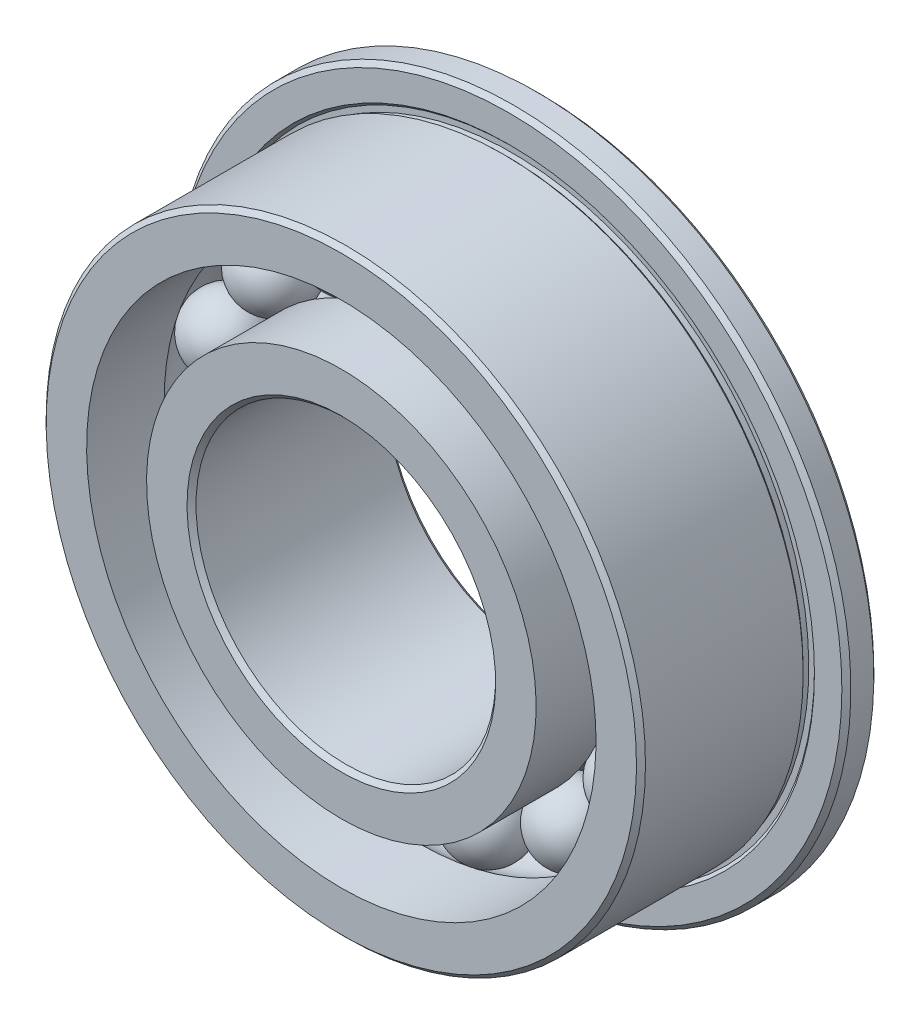
ISO-10303-21;
HEADER;
FILE_DESCRIPTION(('STEP AP214'),'2;1');
FILE_NAME('part.step','',(''),(''),'','','');
FILE_SCHEMA(('AUTOMOTIVE_DESIGN { 1 0 10303 214 1 1 1 1 }'));
ENDSEC;
DATA;
#1=APPLICATION_CONTEXT('core data for automotive mechanical design processes');
#2=APPLICATION_PROTOCOL_DEFINITION('international standard','automotive_design',2000,#1);
#3=PRODUCT_CONTEXT('',#1,'mechanical');
#4=PRODUCT('Part','Part','',(#3));
#5=PRODUCT_RELATED_PRODUCT_CATEGORY('part','',(#4));
#6=PRODUCT_DEFINITION_FORMATION('','',#4);
#7=PRODUCT_DEFINITION_CONTEXT('part definition',#1,'design');
#8=PRODUCT_DEFINITION('design','',#6,#7);
#9=PRODUCT_DEFINITION_SHAPE('','',#8);
#10=(LENGTH_UNIT() NAMED_UNIT(*) SI_UNIT(.MILLI.,.METRE.));
#11=(NAMED_UNIT(*) PLANE_ANGLE_UNIT() SI_UNIT($,.RADIAN.));
#12=(NAMED_UNIT(*) SI_UNIT($,.STERADIAN.) SOLID_ANGLE_UNIT());
#13=UNCERTAINTY_MEASURE_WITH_UNIT(LENGTH_MEASURE(1.E-05),#10,'distance_accuracy_value','');
#14=(GEOMETRIC_REPRESENTATION_CONTEXT(3) GLOBAL_UNCERTAINTY_ASSIGNED_CONTEXT((#13)) GLOBAL_UNIT_ASSIGNED_CONTEXT((#10,
#11,#12)) REPRESENTATION_CONTEXT('',''));
#15=CARTESIAN_POINT('',(0.,0.,0.));
#16=DIRECTION('',(0.,0.,1.));
#17=DIRECTION('',(1.,0.,0.));
#18=AXIS2_PLACEMENT_3D('',#15,#16,#17);
#19=CARTESIAN_POINT('',(-1.45281244698633,3.26307018151718,0.));
#20=DIRECTION('',(-0.406736643075789,0.913545457642606,0.));
#21=DIRECTION('',(0.913545457642606,0.406736643075789,0.));
#22=AXIS2_PLACEMENT_3D('',#19,#20,#21);
#23=SPHERICAL_SURFACE('',#22,0.5953125);
#24=CARTESIAN_POINT('',(-1.69494785481739,3.80691521177005,0.));
#25=VERTEX_POINT('',#24);
#26=VERTEX_LOOP('',#25);
#27=FACE_BOUND('',#26,.T.);
#28=ADVANCED_FACE('F45',(#27),#23,.T.);
#29=CLOSED_SHELL('',(#28));
#30=MANIFOLD_SOLID_BREP('B2',#29);
#31=CARTESIAN_POINT('',(-2.65442042350204,2.39005088458808,0.));
#32=DIRECTION('',(-0.743144825477386,0.669130606358867,0.));
#33=DIRECTION('',(0.669130606358867,0.743144825477386,0.));
#34=AXIS2_PLACEMENT_3D('',#31,#32,#33);
#35=SPHERICAL_SURFACE('',#34,0.5953125);
#36=CARTESIAN_POINT('',(-3.09682382741905,2.78839269868609,0.));
#37=VERTEX_POINT('',#36);
#38=VERTEX_LOOP('',#37);
#39=FACE_BOUND('',#38,.T.);
#40=ADVANCED_FACE('F64',(#39),#35,.T.);
#41=CLOSED_SHELL('',(#40));
#42=MANIFOLD_SOLID_BREP('B7',#41);
#43=CARTESIAN_POINT('',(-3.39705499414174,1.10377007678305,0.));
#44=DIRECTION('',(-0.95105651629515,0.309016994374957,0.));
#45=DIRECTION('',(0.309016994374957,0.95105651629515,0.));
#46=AXIS2_PLACEMENT_3D('',#43,#44,#45);
#47=SPHERICAL_SURFACE('',#46,0.5953125);
#48=CARTESIAN_POINT('',(-3.9632308264987,1.28773175624689,0.));
#49=VERTEX_POINT('',#48);
#50=VERTEX_LOOP('',#49);
#51=FACE_BOUND('',#50,.T.);
#52=ADVANCED_FACE('F82',(#51),#47,.T.);
#53=CLOSED_SHELL('',(#52));
#54=MANIFOLD_SOLID_BREP('B41',#53);
#55=CARTESIAN_POINT('',(-3.55230789501856,-0.373362604734115,0.));
#56=DIRECTION('',(-0.994521895368274,-0.104528463267644,0.));
#57=DIRECTION('',(-0.104528463267644,0.994521895368274,0.));
#58=AXIS2_PLACEMENT_3D('',#55,#56,#57);
#59=SPHERICAL_SURFACE('',#58,0.5953125);
#60=CARTESIAN_POINT('',(-4.14435921085498,-0.435589705523134,0.));
#61=VERTEX_POINT('',#60);
#62=VERTEX_LOOP('',#61);
#63=FACE_BOUND('',#62,.T.);
#64=ADVANCED_FACE('F100',(#63),#59,.T.);
#65=CLOSED_SHELL('',(#64));
#66=MANIFOLD_SOLID_BREP('B60',#65);
#67=CARTESIAN_POINT('',(-3.09333448914256,-1.78593749999997,0.));
#68=DIRECTION('',(-0.866025403784443,-0.499999999999992,0.));
#69=DIRECTION('',(-0.499999999999992,0.866025403784443,0.));
#70=AXIS2_PLACEMENT_3D('',#67,#68,#69);
#71=SPHERICAL_SURFACE('',#70,0.5953125);
#72=CARTESIAN_POINT('',(-3.60889023733298,-2.08359374999997,0.));
#73=VERTEX_POINT('',#72);
#74=VERTEX_LOOP('',#73);
#75=FACE_BOUND('',#74,.T.);
#76=ADVANCED_FACE('F119',(#75),#71,.T.);
#77=CLOSED_SHELL('',(#76));
#78=MANIFOLD_SOLID_BREP('B78',#77);
#79=CARTESIAN_POINT('',(-2.0994954480322,-2.889707576783,0.));
#80=DIRECTION('',(-0.58778525229248,-0.809016994374943,0.));
#81=DIRECTION('',(-0.809016994374943,0.58778525229248,0.));
#82=AXIS2_PLACEMENT_3D('',#79,#80,#81);
#83=SPHERICAL_SURFACE('',#82,0.5953125);
#84=CARTESIAN_POINT('',(-2.44941135603757,-3.37132550624683,0.));
#85=VERTEX_POINT('',#84);
#86=VERTEX_LOOP('',#85);
#87=FACE_BOUND('',#86,.T.);
#88=ADVANCED_FACE('F138',(#87),#83,.T.);
#89=CLOSED_SHELL('',(#88));
#90=MANIFOLD_SOLID_BREP('B96',#89);
#91=CARTESIAN_POINT('',(-0.74263457063971,-3.49382096137106,0.));
#92=DIRECTION('',(-0.207911690817766,-0.978147600733804,0.));
#93=DIRECTION('',(-0.978147600733804,0.207911690817766,0.));
#94=AXIS2_PLACEMENT_3D('',#91,#92,#93);
#95=SPHERICAL_SURFACE('',#94,0.5953125);
#96=CARTESIAN_POINT('',(-0.866406999079661,-4.0761244549329,0.));
#97=VERTEX_POINT('',#96);
#98=VERTEX_LOOP('',#97);
#99=FACE_BOUND('',#98,.T.);
#100=ADVANCED_FACE('F157',(#99),#95,.T.);
#101=CLOSED_SHELL('',(#100));
#102=MANIFOLD_SOLID_BREP('B115',#101);
#103=CARTESIAN_POINT('',(0.742634570639662,-3.49382096137107,0.));
#104=DIRECTION('',(0.207911690817753,-0.978147600733807,0.));
#105=DIRECTION('',(-0.978147600733807,-0.207911690817753,0.));
#106=AXIS2_PLACEMENT_3D('',#103,#104,#105);
#107=SPHERICAL_SURFACE('',#106,0.5953125);
#108=CARTESIAN_POINT('',(0.866406999079606,-4.07612445493291,0.));
#109=VERTEX_POINT('',#108);
#110=VERTEX_LOOP('',#109);
#111=FACE_BOUND('',#110,.T.);
#112=ADVANCED_FACE('F176',(#111),#107,.T.);
#113=CLOSED_SHELL('',(#112));
#114=MANIFOLD_SOLID_BREP('B134',#113);
#115=CARTESIAN_POINT('',(2.09949544803216,-2.88970757678303,0.));
#116=DIRECTION('',(0.587785252292469,-0.80901699437495,0.));
#117=DIRECTION('',(-0.80901699437495,-0.587785252292469,0.));
#118=AXIS2_PLACEMENT_3D('',#115,#116,#117);
#119=SPHERICAL_SURFACE('',#118,0.5953125);
#120=CARTESIAN_POINT('',(2.44941135603752,-3.37132550624686,0.));
#121=VERTEX_POINT('',#120);
#122=VERTEX_LOOP('',#121);
#123=FACE_BOUND('',#122,.T.);
#124=ADVANCED_FACE('F195',(#123),#119,.T.);
#125=CLOSED_SHELL('',(#124));
#126=MANIFOLD_SOLID_BREP('B153',#125);
#127=CARTESIAN_POINT('',(3.09333448914253,-1.78593750000001,0.));
#128=DIRECTION('',(0.866025403784436,-0.500000000000004,0.));
#129=DIRECTION('',(-0.500000000000004,-0.866025403784436,0.));
#130=AXIS2_PLACEMENT_3D('',#127,#128,#129);
#131=SPHERICAL_SURFACE('',#130,0.5953125);
#132=CARTESIAN_POINT('',(3.60889023733296,-2.08359375000002,0.));
#133=VERTEX_POINT('',#132);
#134=VERTEX_LOOP('',#133);
#135=FACE_BOUND('',#134,.T.);
#136=ADVANCED_FACE('F214',(#135),#131,.T.);
#137=CLOSED_SHELL('',(#136));
#138=MANIFOLD_SOLID_BREP('B172',#137);
#139=CARTESIAN_POINT('',(3.55230789501855,-0.373362604734163,0.));
#140=DIRECTION('',(0.994521895368273,-0.104528463267657,0.));
#141=DIRECTION('',(-0.104528463267657,-0.994521895368273,0.));
#142=AXIS2_PLACEMENT_3D('',#139,#140,#141);
#143=SPHERICAL_SURFACE('',#142,0.5953125);
#144=CARTESIAN_POINT('',(4.14435921085497,-0.43558970552319,0.));
#145=VERTEX_POINT('',#144);
#146=VERTEX_LOOP('',#145);
#147=FACE_BOUND('',#146,.T.);
#148=ADVANCED_FACE('F233',(#147),#143,.T.);
#149=CLOSED_SHELL('',(#148));
#150=MANIFOLD_SOLID_BREP('B191',#149);
#151=CARTESIAN_POINT('',(3.39705499414175,1.10377007678301,0.));
#152=DIRECTION('',(0.951056516295154,0.309016994374945,0.));
#153=DIRECTION('',(0.309016994374945,-0.951056516295154,0.));
#154=AXIS2_PLACEMENT_3D('',#151,#152,#153);
#155=SPHERICAL_SURFACE('',#154,0.5953125);
#156=CARTESIAN_POINT('',(3.96323082649871,1.28773175624684,0.));
#157=VERTEX_POINT('',#156);
#158=VERTEX_LOOP('',#157);
#159=FACE_BOUND('',#158,.T.);
#160=ADVANCED_FACE('F252',(#159),#155,.T.);
#161=CLOSED_SHELL('',(#160));
#162=MANIFOLD_SOLID_BREP('B210',#161);
#163=CARTESIAN_POINT('',(2.65442042350207,2.39005088458804,0.));
#164=DIRECTION('',(0.743144825477395,0.669130606358857,0.));
#165=DIRECTION('',(0.669130606358857,-0.743144825477395,0.));
#166=AXIS2_PLACEMENT_3D('',#163,#164,#165);
#167=SPHERICAL_SURFACE('',#166,0.5953125);
#168=CARTESIAN_POINT('',(3.09682382741908,2.78839269868605,0.));
#169=VERTEX_POINT('',#168);
#170=VERTEX_LOOP('',#169);
#171=FACE_BOUND('',#170,.T.);
#172=ADVANCED_FACE('F270',(#171),#167,.T.);
#173=CLOSED_SHELL('',(#172));
#174=MANIFOLD_SOLID_BREP('B229',#173);
#175=CARTESIAN_POINT('',(1.45281244698638,3.26307018151716,0.));
#176=DIRECTION('',(0.406736643075801,0.913545457642601,0.));
#177=DIRECTION('',(0.913545457642601,-0.406736643075801,0.));
#178=AXIS2_PLACEMENT_3D('',#175,#176,#177);
#179=SPHERICAL_SURFACE('',#178,0.5953125);
#180=CARTESIAN_POINT('',(1.69494785481744,3.80691521177002,0.));
#181=VERTEX_POINT('',#180);
#182=VERTEX_LOOP('',#181);
#183=FACE_BOUND('',#182,.T.);
#184=ADVANCED_FACE('F288',(#183),#179,.T.);
#185=CLOSED_SHELL('',(#184));
#186=MANIFOLD_SOLID_BREP('B248',#185);
#187=CARTESIAN_POINT('',(0.,3.571875,0.));
#188=DIRECTION('',(0.,1.,0.));
#189=DIRECTION('',(1.,0.,0.));
#190=AXIS2_PLACEMENT_3D('',#187,#188,#189);
#191=SPHERICAL_SURFACE('',#190,0.5953125);
#192=CARTESIAN_POINT('',(0.,4.1671875,0.));
#193=VERTEX_POINT('',#192);
#194=VERTEX_LOOP('',#193);
#195=FACE_BOUND('',#194,.T.);
#196=ADVANCED_FACE('F310',(#195),#191,.T.);
#197=CLOSED_SHELL('',(#196));
#198=MANIFOLD_SOLID_BREP('B266',#197);
#199=CARTESIAN_POINT('',(0.,0.,0.));
#200=DIRECTION('',(0.,0.,1.));
#201=DIRECTION('',(0.,-1.,0.));
#202=AXIS2_PLACEMENT_3D('',#199,#200,#201);
#203=CYLINDRICAL_SURFACE('',#202,3.095625);
#204=CARTESIAN_POINT('',(0.,0.,-0.3571875));
#205=DIRECTION('',(0.,0.,1.));
#206=DIRECTION('',(0.,-1.,0.));
#207=AXIS2_PLACEMENT_3D('',#204,#205,#206);
#208=CIRCLE('',#207,3.095625);
#209=CARTESIAN_POINT('',(0.,-3.095625,-0.3571875));
#210=VERTEX_POINT('',#209);
#211=EDGE_CURVE('E357',#210,#210,#208,.T.);
#212=ORIENTED_EDGE('',*,*,#211,.F.);
#213=EDGE_LOOP('',(#212));
#214=FACE_BOUND('',#213,.T.);
#215=CARTESIAN_POINT('',(0.,0.,-1.5875));
#216=DIRECTION('',(0.,0.,1.));
#217=DIRECTION('',(0.,-1.,0.));
#218=AXIS2_PLACEMENT_3D('',#215,#216,#217);
#219=CIRCLE('',#218,3.095625);
#220=CARTESIAN_POINT('',(0.,-3.095625,-1.5875));
#221=VERTEX_POINT('',#220);
#222=EDGE_CURVE('E368',#221,#221,#219,.T.);
#223=ORIENTED_EDGE('',*,*,#222,.T.);
#224=EDGE_LOOP('',(#223));
#225=FACE_BOUND('',#224,.T.);
#226=ADVANCED_FACE('F332',(#214,#225),#203,.T.);
#227=CARTESIAN_POINT('',(0.,0.,0.));
#228=DIRECTION('',(0.,0.,1.));
#229=DIRECTION('',(0.,-1.,0.));
#230=AXIS2_PLACEMENT_3D('',#227,#228,#229);
#231=TOROIDAL_SURFACE('',#230,3.571875,0.5953125);
#232=CARTESIAN_POINT('',(0.,0.,0.3571875));
#233=DIRECTION('',(0.,0.,1.));
#234=DIRECTION('',(0.,-1.,0.));
#235=AXIS2_PLACEMENT_3D('',#232,#233,#234);
#236=CIRCLE('',#235,3.095625);
#237=CARTESIAN_POINT('',(0.,-3.095625,0.357187499999999));
#238=VERTEX_POINT('',#237);
#239=EDGE_CURVE('E361',#238,#238,#236,.T.);
#240=ORIENTED_EDGE('',*,*,#239,.F.);
#241=EDGE_LOOP('',(#240));
#242=FACE_BOUND('',#241,.T.);
#243=ORIENTED_EDGE('',*,*,#211,.T.);
#244=EDGE_LOOP('',(#243));
#245=FACE_BOUND('',#244,.T.);
#246=ADVANCED_FACE('F388',(#242,#245),#231,.F.);
#247=CARTESIAN_POINT('',(0.,0.,0.));
#248=DIRECTION('',(0.,0.,1.));
#249=DIRECTION('',(0.,-1.,0.));
#250=AXIS2_PLACEMENT_3D('',#247,#248,#249);
#251=CYLINDRICAL_SURFACE('',#250,3.095625);
#252=CARTESIAN_POINT('',(0.,0.,1.5875));
#253=DIRECTION('',(0.,0.,1.));
#254=DIRECTION('',(0.,-1.,0.));
#255=AXIS2_PLACEMENT_3D('',#252,#253,#254);
#256=CIRCLE('',#255,3.095625);
#257=CARTESIAN_POINT('',(0.,-3.095625,1.5875));
#258=VERTEX_POINT('',#257);
#259=EDGE_CURVE('E365',#258,#258,#256,.T.);
#260=ORIENTED_EDGE('',*,*,#259,.F.);
#261=EDGE_LOOP('',(#260));
#262=FACE_BOUND('',#261,.T.);
#263=ORIENTED_EDGE('',*,*,#239,.T.);
#264=EDGE_LOOP('',(#263));
#265=FACE_BOUND('',#264,.T.);
#266=ADVANCED_FACE('F394',(#262,#265),#251,.T.);
#267=CARTESIAN_POINT('',(0.,2.38125,1.5875));
#268=DIRECTION('',(0.,0.,-1.));
#269=DIRECTION('',(0.,1.,0.));
#270=AXIS2_PLACEMENT_3D('',#267,#268,#269);
#271=PLANE('',#270);
#272=CARTESIAN_POINT('',(0.,0.,1.5875));
#273=DIRECTION('',(0.,0.,-1.));
#274=DIRECTION('',(0.,1.,0.));
#275=AXIS2_PLACEMENT_3D('',#272,#273,#274);
#276=CIRCLE('',#275,2.4526875);
#277=CARTESIAN_POINT('',(0.,2.4526875,1.5875));
#278=VERTEX_POINT('',#277);
#279=EDGE_CURVE('E309',#278,#278,#276,.T.);
#280=ORIENTED_EDGE('',*,*,#279,.T.);
#281=EDGE_LOOP('',(#280));
#282=FACE_BOUND('',#281,.T.);
#283=ORIENTED_EDGE('',*,*,#259,.T.);
#284=EDGE_LOOP('',(#283));
#285=FACE_BOUND('',#284,.T.);
#286=ADVANCED_FACE('F385',(#282,#285),#271,.F.);
#287=CARTESIAN_POINT('',(0.,0.,0.));
#288=DIRECTION('',(0.,0.,1.));
#289=DIRECTION('',(0.,-1.,0.));
#290=AXIS2_PLACEMENT_3D('',#287,#288,#289);
#291=CYLINDRICAL_SURFACE('',#290,2.38125);
#292=CARTESIAN_POINT('',(0.,0.,-1.5160625));
#293=DIRECTION('',(0.,0.,1.));
#294=DIRECTION('',(0.,-1.,0.));
#295=AXIS2_PLACEMENT_3D('',#292,#293,#294);
#296=CIRCLE('',#295,2.38125);
#297=CARTESIAN_POINT('',(0.,-2.38125,-1.5160625));
#298=VERTEX_POINT('',#297);
#299=EDGE_CURVE('E340',#298,#298,#296,.F.);
#300=ORIENTED_EDGE('',*,*,#299,.T.);
#301=EDGE_LOOP('',(#300));
#302=FACE_BOUND('',#301,.T.);
#303=CARTESIAN_POINT('',(0.,0.,1.5160625));
#304=DIRECTION('',(0.,0.,-1.));
#305=DIRECTION('',(0.,1.,0.));
#306=AXIS2_PLACEMENT_3D('',#303,#304,#305);
#307=CIRCLE('',#306,2.38125);
#308=CARTESIAN_POINT('',(0.,2.38125,1.5160625));
#309=VERTEX_POINT('',#308);
#310=EDGE_CURVE('E346',#309,#309,#307,.F.);
#311=ORIENTED_EDGE('',*,*,#310,.T.);
#312=EDGE_LOOP('',(#311));
#313=FACE_BOUND('',#312,.T.);
#314=ADVANCED_FACE('F377',(#302,#313),#291,.F.);
#315=CARTESIAN_POINT('',(0.,3.095625,-1.5875));
#316=DIRECTION('',(0.,0.,1.));
#317=DIRECTION('',(0.,-1.,0.));
#318=AXIS2_PLACEMENT_3D('',#315,#316,#317);
#319=PLANE('',#318);
#320=CARTESIAN_POINT('',(0.,0.,-1.5875));
#321=DIRECTION('',(0.,0.,1.));
#322=DIRECTION('',(0.,-1.,0.));
#323=AXIS2_PLACEMENT_3D('',#320,#321,#322);
#324=CIRCLE('',#323,2.4526875);
#325=CARTESIAN_POINT('',(0.,-2.4526875,-1.5875));
#326=VERTEX_POINT('',#325);
#327=EDGE_CURVE('E352',#326,#326,#324,.T.);
#328=ORIENTED_EDGE('',*,*,#327,.T.);
#329=EDGE_LOOP('',(#328));
#330=FACE_BOUND('',#329,.T.);
#331=ORIENTED_EDGE('',*,*,#222,.F.);
#332=EDGE_LOOP('',(#331));
#333=FACE_BOUND('',#332,.T.);
#334=ADVANCED_FACE('F374',(#330,#333),#319,.F.);
#335=CARTESIAN_POINT('',(0.,0.,-1.5875));
#336=DIRECTION('',(0.,0.,-1.));
#337=DIRECTION('',(0.,1.,0.));
#338=AXIS2_PLACEMENT_3D('',#335,#336,#337);
#339=CONICAL_SURFACE('',#338,2.4526875,0.785398163397448);
#340=ORIENTED_EDGE('',*,*,#299,.F.);
#341=EDGE_LOOP('',(#340));
#342=FACE_BOUND('',#341,.T.);
#343=ORIENTED_EDGE('',*,*,#327,.F.);
#344=EDGE_LOOP('',(#343));
#345=FACE_BOUND('',#344,.T.);
#346=ADVANCED_FACE('F376',(#342,#345),#339,.F.);
#347=CARTESIAN_POINT('',(0.,0.,1.5160625));
#348=DIRECTION('',(0.,0.,1.));
#349=DIRECTION('',(0.,-1.,0.));
#350=AXIS2_PLACEMENT_3D('',#347,#348,#349);
#351=CONICAL_SURFACE('',#350,2.38125,0.785398163397448);
#352=ORIENTED_EDGE('',*,*,#279,.F.);
#353=EDGE_LOOP('',(#352));
#354=FACE_BOUND('',#353,.T.);
#355=ORIENTED_EDGE('',*,*,#310,.F.);
#356=EDGE_LOOP('',(#355));
#357=FACE_BOUND('',#356,.T.);
#358=ADVANCED_FACE('F334',(#354,#357),#351,.F.);
#359=CLOSED_SHELL('',(#226,#246,#266,#286,#314,#334,#346,#358));
#360=MANIFOLD_SOLID_BREP('B284',#359);
#361=CARTESIAN_POINT('',(0.,4.048125,-1.5875));
#362=DIRECTION('',(0.,0.,1.));
#363=DIRECTION('',(0.,-1.,0.));
#364=AXIS2_PLACEMENT_3D('',#361,#362,#363);
#365=PLANE('',#364);
#366=CARTESIAN_POINT('',(0.,0.,-1.5875));
#367=DIRECTION('',(0.,0.,1.));
#368=DIRECTION('',(0.,-1.,0.));
#369=AXIS2_PLACEMENT_3D('',#366,#367,#368);
#370=CIRCLE('',#369,5.2879625);
#371=CARTESIAN_POINT('',(0.,-5.2879625,-1.5875));
#372=VERTEX_POINT('',#371);
#373=EDGE_CURVE('E490',#372,#372,#370,.F.);
#374=ORIENTED_EDGE('',*,*,#373,.T.);
#375=EDGE_LOOP('',(#374));
#376=FACE_BOUND('',#375,.T.);
#377=CARTESIAN_POINT('',(0.,0.,-1.5875));
#378=DIRECTION('',(0.,0.,1.));
#379=DIRECTION('',(0.,-1.,0.));
#380=AXIS2_PLACEMENT_3D('',#377,#378,#379);
#381=CIRCLE('',#380,4.048125);
#382=CARTESIAN_POINT('',(0.,-4.048125,-1.5875));
#383=VERTEX_POINT('',#382);
#384=EDGE_CURVE('E504',#383,#383,#381,.T.);
#385=ORIENTED_EDGE('',*,*,#384,.T.);
#386=EDGE_LOOP('',(#385));
#387=FACE_BOUND('',#386,.T.);
#388=ADVANCED_FACE('F470',(#376,#387),#365,.F.);
#389=CARTESIAN_POINT('',(0.,0.,0.));
#390=DIRECTION('',(0.,0.,1.));
#391=DIRECTION('',(0.,-1.,0.));
#392=AXIS2_PLACEMENT_3D('',#389,#390,#391);
#393=CYLINDRICAL_SURFACE('',#392,4.048125);
#394=ORIENTED_EDGE('',*,*,#384,.F.);
#395=EDGE_LOOP('',(#394));
#396=FACE_BOUND('',#395,.T.);
#397=CARTESIAN_POINT('',(0.,0.,-0.3571875));
#398=DIRECTION('',(0.,0.,1.));
#399=DIRECTION('',(0.,-1.,0.));
#400=AXIS2_PLACEMENT_3D('',#397,#398,#399);
#401=CIRCLE('',#400,4.048125);
#402=CARTESIAN_POINT('',(0.,-4.048125,-0.3571875));
#403=VERTEX_POINT('',#402);
#404=EDGE_CURVE('E508',#403,#403,#401,.T.);
#405=ORIENTED_EDGE('',*,*,#404,.T.);
#406=EDGE_LOOP('',(#405));
#407=FACE_BOUND('',#406,.T.);
#408=ADVANCED_FACE('F557',(#396,#407),#393,.F.);
#409=CARTESIAN_POINT('',(0.,0.,0.));
#410=DIRECTION('',(0.,0.,1.));
#411=DIRECTION('',(0.,-1.,0.));
#412=AXIS2_PLACEMENT_3D('',#409,#410,#411);
#413=TOROIDAL_SURFACE('',#412,3.571875,0.5953125);
#414=ORIENTED_EDGE('',*,*,#404,.F.);
#415=EDGE_LOOP('',(#414));
#416=FACE_BOUND('',#415,.T.);
#417=CARTESIAN_POINT('',(0.,0.,0.3571875));
#418=DIRECTION('',(0.,0.,1.));
#419=DIRECTION('',(0.,-1.,0.));
#420=AXIS2_PLACEMENT_3D('',#417,#418,#419);
#421=CIRCLE('',#420,4.048125);
#422=CARTESIAN_POINT('',(0.,-4.048125,0.357187499999999));
#423=VERTEX_POINT('',#422);
#424=EDGE_CURVE('E511',#423,#423,#421,.T.);
#425=ORIENTED_EDGE('',*,*,#424,.T.);
#426=EDGE_LOOP('',(#425));
#427=FACE_BOUND('',#426,.T.);
#428=ADVANCED_FACE('F563',(#416,#427),#413,.F.);
#429=CARTESIAN_POINT('',(0.,0.,0.));
#430=DIRECTION('',(0.,0.,1.));
#431=DIRECTION('',(0.,-1.,0.));
#432=AXIS2_PLACEMENT_3D('',#429,#430,#431);
#433=CYLINDRICAL_SURFACE('',#432,4.048125);
#434=ORIENTED_EDGE('',*,*,#424,.F.);
#435=EDGE_LOOP('',(#434));
#436=FACE_BOUND('',#435,.T.);
#437=CARTESIAN_POINT('',(0.,0.,1.5875));
#438=DIRECTION('',(0.,0.,1.));
#439=DIRECTION('',(0.,-1.,0.));
#440=AXIS2_PLACEMENT_3D('',#437,#438,#439);
#441=CIRCLE('',#440,4.048125);
#442=CARTESIAN_POINT('',(0.,-4.048125,1.5875));
#443=VERTEX_POINT('',#442);
#444=EDGE_CURVE('E515',#443,#443,#441,.T.);
#445=ORIENTED_EDGE('',*,*,#444,.T.);
#446=EDGE_LOOP('',(#445));
#447=FACE_BOUND('',#446,.T.);
#448=ADVANCED_FACE('F625',(#436,#447),#433,.F.);
#449=CARTESIAN_POINT('',(0.,4.7625,1.5875));
#450=DIRECTION('',(0.,0.,-1.));
#451=DIRECTION('',(0.,1.,0.));
#452=AXIS2_PLACEMENT_3D('',#449,#450,#451);
#453=PLANE('',#452);
#454=CARTESIAN_POINT('',(0.,0.,1.5875));
#455=DIRECTION('',(0.,0.,-1.));
#456=DIRECTION('',(0.,1.,0.));
#457=AXIS2_PLACEMENT_3D('',#454,#455,#456);
#458=CIRCLE('',#457,4.6910625);
#459=CARTESIAN_POINT('',(0.,4.6910625,1.5875));
#460=VERTEX_POINT('',#459);
#461=EDGE_CURVE('E478',#460,#460,#458,.F.);
#462=ORIENTED_EDGE('',*,*,#461,.T.);
#463=EDGE_LOOP('',(#462));
#464=FACE_BOUND('',#463,.T.);
#465=ORIENTED_EDGE('',*,*,#444,.F.);
#466=EDGE_LOOP('',(#465));
#467=FACE_BOUND('',#466,.T.);
#468=ADVANCED_FACE('F638',(#464,#467),#453,.F.);
#469=CARTESIAN_POINT('',(0.,0.,0.));
#470=DIRECTION('',(0.,0.,1.));
#471=DIRECTION('',(0.,-1.,0.));
#472=AXIS2_PLACEMENT_3D('',#469,#470,#471);
#473=CYLINDRICAL_SURFACE('',#472,4.7625);
#474=CARTESIAN_POINT('',(0.,0.,1.5160625));
#475=DIRECTION('',(0.,0.,-1.));
#476=DIRECTION('',(0.,1.,0.));
#477=AXIS2_PLACEMENT_3D('',#474,#475,#476);
#478=CIRCLE('',#477,4.7625);
#479=CARTESIAN_POINT('',(0.,4.7625,1.5160625));
#480=VERTEX_POINT('',#479);
#481=EDGE_CURVE('E331',#480,#480,#478,.T.);
#482=ORIENTED_EDGE('',*,*,#481,.T.);
#483=EDGE_LOOP('',(#482));
#484=FACE_BOUND('',#483,.T.);
#485=CARTESIAN_POINT('',(0.,0.,-0.989697438789311));
#486=DIRECTION('',(0.,0.,1.));
#487=DIRECTION('',(0.,-1.,0.));
#488=AXIS2_PLACEMENT_3D('',#485,#486,#487);
#489=CIRCLE('',#488,4.7625);
#490=CARTESIAN_POINT('',(0.,-4.7625,-0.989697438789311));
#491=VERTEX_POINT('',#490);
#492=EDGE_CURVE('E519',#491,#491,#489,.T.);
#493=ORIENTED_EDGE('',*,*,#492,.T.);
#494=EDGE_LOOP('',(#493));
#495=FACE_BOUND('',#494,.T.);
#496=ADVANCED_FACE('F645',(#484,#495),#473,.T.);
#497=CARTESIAN_POINT('',(0.,0.,-1.03459871939466));
#498=DIRECTION('',(0.,0.,1.));
#499=DIRECTION('',(0.,-1.,0.));
#500=AXIS2_PLACEMENT_3D('',#497,#498,#499);
#501=CONICAL_SURFACE('',#500,4.71759871939465,0.785398163397458);
#502=ORIENTED_EDGE('',*,*,#492,.F.);
#503=EDGE_LOOP('',(#502));
#504=FACE_BOUND('',#503,.T.);
#505=CARTESIAN_POINT('',(0.,0.,-1.03459871939466));
#506=DIRECTION('',(0.,0.,1.));
#507=DIRECTION('',(0.,-1.,0.));
#508=AXIS2_PLACEMENT_3D('',#505,#506,#507);
#509=CIRCLE('',#508,4.71759871939465);
#510=CARTESIAN_POINT('',(0.,-4.71759871939465,-1.03459871939466));
#511=VERTEX_POINT('',#510);
#512=EDGE_CURVE('E523',#511,#511,#509,.T.);
#513=ORIENTED_EDGE('',*,*,#512,.T.);
#514=EDGE_LOOP('',(#513));
#515=FACE_BOUND('',#514,.T.);
#516=ADVANCED_FACE('F607',(#504,#515),#501,.T.);
#517=CARTESIAN_POINT('',(0.,0.,0.));
#518=DIRECTION('',(0.,0.,1.));
#519=DIRECTION('',(0.,-1.,0.));
#520=AXIS2_PLACEMENT_3D('',#517,#518,#519);
#521=CYLINDRICAL_SURFACE('',#520,4.71759871939465);
#522=ORIENTED_EDGE('',*,*,#512,.F.);
#523=EDGE_LOOP('',(#522));
#524=FACE_BOUND('',#523,.T.);
#525=CARTESIAN_POINT('',(0.,0.,-1.12440128060535));
#526=DIRECTION('',(0.,0.,1.));
#527=DIRECTION('',(0.,-1.,0.));
#528=AXIS2_PLACEMENT_3D('',#525,#526,#527);
#529=CIRCLE('',#528,4.71759871939466);
#530=CARTESIAN_POINT('',(0.,-4.71759871939466,-1.12440128060535));
#531=VERTEX_POINT('',#530);
#532=EDGE_CURVE('E527',#531,#531,#529,.T.);
#533=ORIENTED_EDGE('',*,*,#532,.T.);
#534=EDGE_LOOP('',(#533));
#535=FACE_BOUND('',#534,.T.);
#536=ADVANCED_FACE('F604',(#524,#535),#521,.T.);
#537=CARTESIAN_POINT('',(0.,4.80740128060535,-1.12440128060535));
#538=DIRECTION('',(0.,0.,-1.));
#539=DIRECTION('',(0.,1.,0.));
#540=AXIS2_PLACEMENT_3D('',#537,#538,#539);
#541=PLANE('',#540);
#542=ORIENTED_EDGE('',*,*,#532,.F.);
#543=EDGE_LOOP('',(#542));
#544=FACE_BOUND('',#543,.T.);
#545=CARTESIAN_POINT('',(0.,0.,-1.12440128060535));
#546=DIRECTION('',(0.,0.,1.));
#547=DIRECTION('',(0.,-1.,0.));
#548=AXIS2_PLACEMENT_3D('',#545,#546,#547);
#549=CIRCLE('',#548,4.80740128060535);
#550=CARTESIAN_POINT('',(0.,-4.80740128060535,-1.12440128060535));
#551=VERTEX_POINT('',#550);
#552=EDGE_CURVE('E531',#551,#551,#549,.T.);
#553=ORIENTED_EDGE('',*,*,#552,.T.);
#554=EDGE_LOOP('',(#553));
#555=FACE_BOUND('',#554,.T.);
#556=ADVANCED_FACE('F553',(#544,#555),#541,.F.);
#557=CARTESIAN_POINT('',(0.,0.,-1.0795));
#558=DIRECTION('',(0.,0.,1.));
#559=DIRECTION('',(0.,-1.,0.));
#560=AXIS2_PLACEMENT_3D('',#557,#558,#559);
#561=CONICAL_SURFACE('',#560,4.85230256121069,0.785398163397444);
#562=ORIENTED_EDGE('',*,*,#552,.F.);
#563=EDGE_LOOP('',(#562));
#564=FACE_BOUND('',#563,.T.);
#565=CARTESIAN_POINT('',(0.,0.,-1.0795));
#566=DIRECTION('',(0.,0.,1.));
#567=DIRECTION('',(0.,-1.,0.));
#568=AXIS2_PLACEMENT_3D('',#565,#566,#567);
#569=CIRCLE('',#568,4.85230256121069);
#570=CARTESIAN_POINT('',(0.,-4.85230256121069,-1.0795));
#571=VERTEX_POINT('',#570);
#572=EDGE_CURVE('E535',#571,#571,#569,.T.);
#573=ORIENTED_EDGE('',*,*,#572,.T.);
#574=EDGE_LOOP('',(#573));
#575=FACE_BOUND('',#574,.T.);
#576=ADVANCED_FACE('F539',(#564,#575),#561,.F.);
#577=CARTESIAN_POINT('',(0.,5.3594,-1.0795));
#578=DIRECTION('',(0.,0.,-1.));
#579=DIRECTION('',(0.,1.,0.));
#580=AXIS2_PLACEMENT_3D('',#577,#578,#579);
#581=PLANE('',#580);
#582=CARTESIAN_POINT('',(0.,0.,-1.0795));
#583=DIRECTION('',(0.,0.,-1.));
#584=DIRECTION('',(0.,1.,0.));
#585=AXIS2_PLACEMENT_3D('',#582,#583,#584);
#586=CIRCLE('',#585,5.2879625);
#587=CARTESIAN_POINT('',(0.,5.2879625,-1.0795));
#588=VERTEX_POINT('',#587);
#589=EDGE_CURVE('E484',#588,#588,#586,.F.);
#590=ORIENTED_EDGE('',*,*,#589,.T.);
#591=EDGE_LOOP('',(#590));
#592=FACE_BOUND('',#591,.T.);
#593=ORIENTED_EDGE('',*,*,#572,.F.);
#594=EDGE_LOOP('',(#593));
#595=FACE_BOUND('',#594,.T.);
#596=ADVANCED_FACE('F541',(#592,#595),#581,.F.);
#597=CARTESIAN_POINT('',(0.,0.,0.));
#598=DIRECTION('',(0.,0.,1.));
#599=DIRECTION('',(0.,-1.,0.));
#600=AXIS2_PLACEMENT_3D('',#597,#598,#599);
#601=CYLINDRICAL_SURFACE('',#600,5.3594);
#602=CARTESIAN_POINT('',(0.,0.,-1.5160625));
#603=DIRECTION('',(0.,0.,1.));
#604=DIRECTION('',(0.,-1.,0.));
#605=AXIS2_PLACEMENT_3D('',#602,#603,#604);
#606=CIRCLE('',#605,5.3594);
#607=CARTESIAN_POINT('',(0.,-5.3594,-1.5160625));
#608=VERTEX_POINT('',#607);
#609=EDGE_CURVE('E496',#608,#608,#606,.T.);
#610=ORIENTED_EDGE('',*,*,#609,.T.);
#611=EDGE_LOOP('',(#610));
#612=FACE_BOUND('',#611,.T.);
#613=CARTESIAN_POINT('',(0.,0.,-1.1509375));
#614=DIRECTION('',(0.,0.,-1.));
#615=DIRECTION('',(0.,1.,0.));
#616=AXIS2_PLACEMENT_3D('',#613,#614,#615);
#617=CIRCLE('',#616,5.3594);
#618=CARTESIAN_POINT('',(0.,5.3594,-1.1509375));
#619=VERTEX_POINT('',#618);
#620=EDGE_CURVE('E500',#619,#619,#617,.T.);
#621=ORIENTED_EDGE('',*,*,#620,.T.);
#622=EDGE_LOOP('',(#621));
#623=FACE_BOUND('',#622,.T.);
#624=ADVANCED_FACE('F543',(#612,#623),#601,.T.);
#625=CARTESIAN_POINT('',(0.,0.,-1.5160625));
#626=DIRECTION('',(0.,0.,1.));
#627=DIRECTION('',(0.,-1.,0.));
#628=AXIS2_PLACEMENT_3D('',#625,#626,#627);
#629=CONICAL_SURFACE('',#628,5.3594,0.785398163397451);
#630=ORIENTED_EDGE('',*,*,#373,.F.);
#631=EDGE_LOOP('',(#630));
#632=FACE_BOUND('',#631,.T.);
#633=ORIENTED_EDGE('',*,*,#609,.F.);
#634=EDGE_LOOP('',(#633));
#635=FACE_BOUND('',#634,.T.);
#636=ADVANCED_FACE('F550',(#632,#635),#629,.T.);
#637=CARTESIAN_POINT('',(0.,0.,-1.0795));
#638=DIRECTION('',(0.,0.,-1.));
#639=DIRECTION('',(0.,1.,0.));
#640=AXIS2_PLACEMENT_3D('',#637,#638,#639);
#641=CONICAL_SURFACE('',#640,5.2879625,0.78539816339745);
#642=ORIENTED_EDGE('',*,*,#620,.F.);
#643=EDGE_LOOP('',(#642));
#644=FACE_BOUND('',#643,.T.);
#645=ORIENTED_EDGE('',*,*,#589,.F.);
#646=EDGE_LOOP('',(#645));
#647=FACE_BOUND('',#646,.T.);
#648=ADVANCED_FACE('F570',(#644,#647),#641,.T.);
#649=CARTESIAN_POINT('',(0.,0.,1.5875));
#650=DIRECTION('',(0.,0.,-1.));
#651=DIRECTION('',(0.,1.,0.));
#652=AXIS2_PLACEMENT_3D('',#649,#650,#651);
#653=CONICAL_SURFACE('',#652,4.6910625,0.785398163397451);
#654=ORIENTED_EDGE('',*,*,#481,.F.);
#655=EDGE_LOOP('',(#654));
#656=FACE_BOUND('',#655,.T.);
#657=ORIENTED_EDGE('',*,*,#461,.F.);
#658=EDGE_LOOP('',(#657));
#659=FACE_BOUND('',#658,.T.);
#660=ADVANCED_FACE('F472',(#656,#659),#653,.T.);
#661=CLOSED_SHELL('',(#388,#408,#428,#448,#468,#496,#516,#536,#556,#576,#596,#624,#636,#648,#660));
#662=MANIFOLD_SOLID_BREP('B304',#661);
#663=ADVANCED_BREP_SHAPE_REPRESENTATION('',(#18,#30,#42,#54,#66,#78,#90,#102,#114,#126,#138,
#150,#162,#174,#186,#198,#360,#662),#14);
#664=SHAPE_DEFINITION_REPRESENTATION(#9,#663);
ENDSEC;
END-ISO-10303-21;
